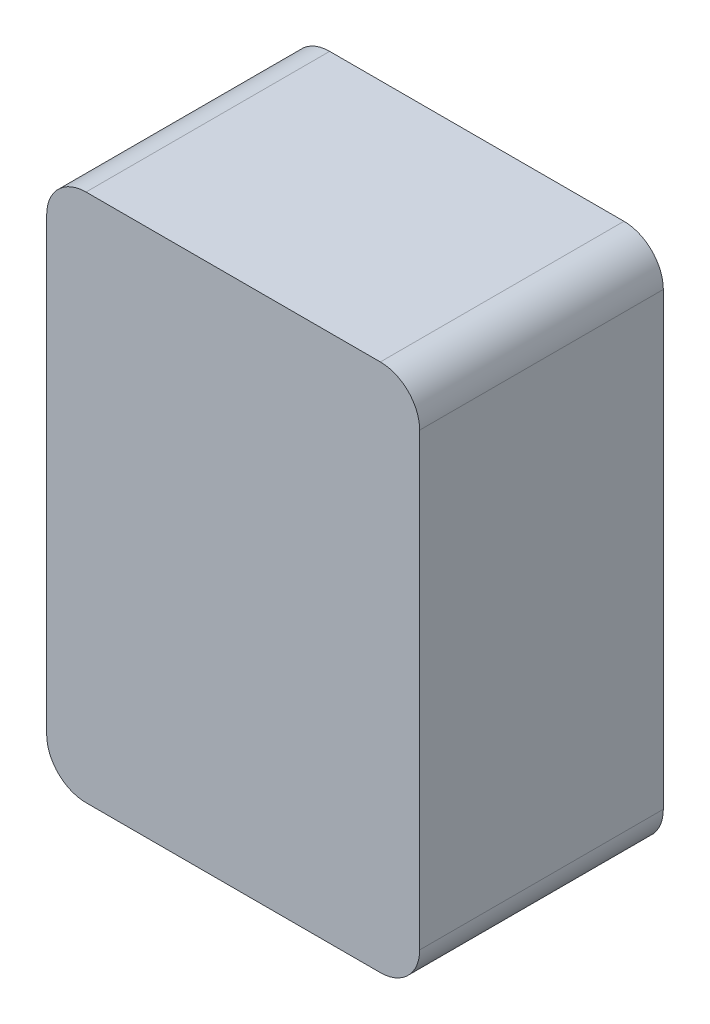
ISO-10303-21;
HEADER;
FILE_DESCRIPTION(('STEP AP214'),'2;1');
FILE_NAME('part.step','',(''),(''),'','','');
FILE_SCHEMA(('AUTOMOTIVE_DESIGN { 1 0 10303 214 1 1 1 1 }'));
ENDSEC;
DATA;
#1=APPLICATION_CONTEXT('core data for automotive mechanical design processes');
#2=APPLICATION_PROTOCOL_DEFINITION('international standard','automotive_design',2000,#1);
#3=PRODUCT_CONTEXT('',#1,'mechanical');
#4=PRODUCT('Part','Part','',(#3));
#5=PRODUCT_RELATED_PRODUCT_CATEGORY('part','',(#4));
#6=PRODUCT_DEFINITION_FORMATION('','',#4);
#7=PRODUCT_DEFINITION_CONTEXT('part definition',#1,'design');
#8=PRODUCT_DEFINITION('design','',#6,#7);
#9=PRODUCT_DEFINITION_SHAPE('','',#8);
#10=(LENGTH_UNIT() NAMED_UNIT(*) SI_UNIT(.MILLI.,.METRE.));
#11=(NAMED_UNIT(*) PLANE_ANGLE_UNIT() SI_UNIT($,.RADIAN.));
#12=(NAMED_UNIT(*) SI_UNIT($,.STERADIAN.) SOLID_ANGLE_UNIT());
#13=UNCERTAINTY_MEASURE_WITH_UNIT(LENGTH_MEASURE(1.E-05),#10,'distance_accuracy_value','');
#14=(GEOMETRIC_REPRESENTATION_CONTEXT(3) GLOBAL_UNCERTAINTY_ASSIGNED_CONTEXT((#13)) GLOBAL_UNIT_ASSIGNED_CONTEXT((#10,
#11,#12)) REPRESENTATION_CONTEXT('',''));
#15=CARTESIAN_POINT('',(0.,0.,0.));
#16=DIRECTION('',(0.,0.,1.));
#17=DIRECTION('',(1.,0.,0.));
#18=AXIS2_PLACEMENT_3D('',#15,#16,#17);
#19=CARTESIAN_POINT('',(-41.8588988114266,66.8355504873493,65.));
#20=DIRECTION('',(0.,0.,-1.));
#21=DIRECTION('',(-1.,0.,0.));
#22=AXIS2_PLACEMENT_3D('',#19,#20,#21);
#23=CYLINDRICAL_SURFACE('',#22,10.5);
#24=CARTESIAN_POINT('',(-41.8588988114266,66.8355504873493,0.));
#25=DIRECTION('',(0.,0.,1.));
#26=DIRECTION('',(1.,0.,0.));
#27=AXIS2_PLACEMENT_3D('',#24,#25,#26);
#28=CIRCLE('',#27,10.5);
#29=CARTESIAN_POINT('',(-41.8588988114266,77.3355504873493,0.));
#30=VERTEX_POINT('',#29);
#31=CARTESIAN_POINT('',(-52.3588988114266,66.8355504873493,0.));
#32=VERTEX_POINT('',#31);
#33=EDGE_CURVE('E141',#30,#32,#28,.T.);
#34=ORIENTED_EDGE('',*,*,#33,.T.);
#35=DIRECTION('',(0.,0.,-1.));
#36=VECTOR('',#35,1.);
#37=CARTESIAN_POINT('',(-52.3588988114266,66.8355504873493,65.));
#38=LINE('',#37,#36);
#39=CARTESIAN_POINT('',(-52.3588988114266,66.8355504873493,65.));
#40=VERTEX_POINT('',#39);
#41=EDGE_CURVE('E11',#40,#32,#38,.T.);
#42=ORIENTED_EDGE('',*,*,#41,.F.);
#43=CARTESIAN_POINT('',(-41.8588988114266,66.8355504873493,65.));
#44=DIRECTION('',(0.,0.,1.));
#45=DIRECTION('',(1.,0.,0.));
#46=AXIS2_PLACEMENT_3D('',#43,#44,#45);
#47=CIRCLE('',#46,10.5);
#48=CARTESIAN_POINT('',(-41.8588988114266,77.3355504873493,65.));
#49=VERTEX_POINT('',#48);
#50=EDGE_CURVE('E161',#49,#40,#47,.T.);
#51=ORIENTED_EDGE('',*,*,#50,.F.);
#52=DIRECTION('',(0.,0.,-1.));
#53=VECTOR('',#52,1.);
#54=CARTESIAN_POINT('',(-41.8588988114266,77.3355504873493,65.));
#55=LINE('',#54,#53);
#56=EDGE_CURVE('E55',#49,#30,#55,.T.);
#57=ORIENTED_EDGE('',*,*,#56,.T.);
#58=EDGE_LOOP('',(#34,#42,#51,#57));
#59=FACE_BOUND('',#58,.T.);
#60=ADVANCED_FACE('F32',(#59),#23,.T.);
#61=CARTESIAN_POINT('',(-52.3588988114266,66.8355504873493,65.));
#62=DIRECTION('',(1.,0.,0.));
#63=DIRECTION('',(0.,0.,-1.));
#64=AXIS2_PLACEMENT_3D('',#61,#62,#63);
#65=PLANE('',#64);
#66=DIRECTION('',(0.,-1.,0.));
#67=VECTOR('',#66,1.);
#68=CARTESIAN_POINT('',(-52.3588988114266,66.8355504873493,0.));
#69=LINE('',#68,#67);
#70=CARTESIAN_POINT('',(-52.3588988114266,-53.2671119245871,0.));
#71=VERTEX_POINT('',#70);
#72=EDGE_CURVE('E143',#32,#71,#69,.T.);
#73=ORIENTED_EDGE('',*,*,#72,.T.);
#74=DIRECTION('',(0.,0.,-1.));
#75=VECTOR('',#74,1.);
#76=CARTESIAN_POINT('',(-52.3588988114266,-53.2671119245871,65.));
#77=LINE('',#76,#75);
#78=CARTESIAN_POINT('',(-52.3588988114266,-53.2671119245871,65.));
#79=VERTEX_POINT('',#78);
#80=EDGE_CURVE('E39',#79,#71,#77,.T.);
#81=ORIENTED_EDGE('',*,*,#80,.F.);
#82=DIRECTION('',(0.,-1.,0.));
#83=VECTOR('',#82,1.);
#84=CARTESIAN_POINT('',(-52.3588988114266,66.8355504873493,65.));
#85=LINE('',#84,#83);
#86=EDGE_CURVE('E94',#40,#79,#85,.T.);
#87=ORIENTED_EDGE('',*,*,#86,.F.);
#88=ORIENTED_EDGE('',*,*,#41,.T.);
#89=EDGE_LOOP('',(#73,#81,#87,#88));
#90=FACE_BOUND('',#89,.T.);
#91=ADVANCED_FACE('F175',(#90),#65,.F.);
#92=CARTESIAN_POINT('',(-41.8588988114266,-53.2671119245871,65.));
#93=DIRECTION('',(0.,0.,-1.));
#94=DIRECTION('',(-1.,0.,0.));
#95=AXIS2_PLACEMENT_3D('',#92,#93,#94);
#96=CYLINDRICAL_SURFACE('',#95,10.5);
#97=CARTESIAN_POINT('',(-41.8588988114266,-53.2671119245871,0.));
#98=DIRECTION('',(0.,0.,-1.));
#99=DIRECTION('',(-1.,0.,0.));
#100=AXIS2_PLACEMENT_3D('',#97,#98,#99);
#101=CIRCLE('',#100,10.5);
#102=CARTESIAN_POINT('',(-41.8588988114266,-63.7671119245871,0.));
#103=VERTEX_POINT('',#102);
#104=EDGE_CURVE('E147',#103,#71,#101,.T.);
#105=ORIENTED_EDGE('',*,*,#104,.F.);
#106=DIRECTION('',(0.,0.,-1.));
#107=VECTOR('',#106,1.);
#108=CARTESIAN_POINT('',(-41.8588988114266,-63.7671119245871,65.));
#109=LINE('',#108,#107);
#110=CARTESIAN_POINT('',(-41.8588988114266,-63.7671119245871,65.));
#111=VERTEX_POINT('',#110);
#112=EDGE_CURVE('E168',#111,#103,#109,.T.);
#113=ORIENTED_EDGE('',*,*,#112,.F.);
#114=CARTESIAN_POINT('',(-41.8588988114266,-53.2671119245871,65.));
#115=DIRECTION('',(0.,0.,-1.));
#116=DIRECTION('',(-1.,0.,0.));
#117=AXIS2_PLACEMENT_3D('',#114,#115,#116);
#118=CIRCLE('',#117,10.5);
#119=EDGE_CURVE('E174',#111,#79,#118,.T.);
#120=ORIENTED_EDGE('',*,*,#119,.T.);
#121=ORIENTED_EDGE('',*,*,#80,.T.);
#122=EDGE_LOOP('',(#105,#113,#120,#121));
#123=FACE_BOUND('',#122,.T.);
#124=ADVANCED_FACE('F172',(#123),#96,.T.);
#125=CARTESIAN_POINT('',(-41.8588988114266,-63.7671119245871,65.));
#126=DIRECTION('',(0.,1.,0.));
#127=DIRECTION('',(0.,0.,1.));
#128=AXIS2_PLACEMENT_3D('',#125,#126,#127);
#129=PLANE('',#128);
#130=DIRECTION('',(1.,0.,0.));
#131=VECTOR('',#130,1.);
#132=CARTESIAN_POINT('',(-41.8588988114266,-63.7671119245871,0.));
#133=LINE('',#132,#131);
#134=CARTESIAN_POINT('',(36.6581129466659,-63.7671119245871,0.));
#135=VERTEX_POINT('',#134);
#136=EDGE_CURVE('E150',#103,#135,#133,.T.);
#137=ORIENTED_EDGE('',*,*,#136,.T.);
#138=DIRECTION('',(0.,0.,-1.));
#139=VECTOR('',#138,1.);
#140=CARTESIAN_POINT('',(36.6581129466659,-63.7671119245871,65.));
#141=LINE('',#140,#139);
#142=CARTESIAN_POINT('',(36.6581129466659,-63.7671119245871,65.));
#143=VERTEX_POINT('',#142);
#144=EDGE_CURVE('E165',#143,#135,#141,.T.);
#145=ORIENTED_EDGE('',*,*,#144,.F.);
#146=DIRECTION('',(1.,0.,0.));
#147=VECTOR('',#146,1.);
#148=CARTESIAN_POINT('',(-41.8588988114266,-63.7671119245871,65.));
#149=LINE('',#148,#147);
#150=EDGE_CURVE('E187',#111,#143,#149,.T.);
#151=ORIENTED_EDGE('',*,*,#150,.F.);
#152=ORIENTED_EDGE('',*,*,#112,.T.);
#153=EDGE_LOOP('',(#137,#145,#151,#152));
#154=FACE_BOUND('',#153,.T.);
#155=ADVANCED_FACE('F183',(#154),#129,.F.);
#156=CARTESIAN_POINT('',(36.6581129466659,-53.2671119245871,65.));
#157=DIRECTION('',(0.,0.,-1.));
#158=DIRECTION('',(-1.,0.,0.));
#159=AXIS2_PLACEMENT_3D('',#156,#157,#158);
#160=CYLINDRICAL_SURFACE('',#159,10.5);
#161=CARTESIAN_POINT('',(36.6581129466659,-53.2671119245871,0.));
#162=DIRECTION('',(0.,0.,1.));
#163=DIRECTION('',(1.,0.,0.));
#164=AXIS2_PLACEMENT_3D('',#161,#162,#163);
#165=CIRCLE('',#164,10.5);
#166=CARTESIAN_POINT('',(47.1581129466659,-53.2671119245871,0.));
#167=VERTEX_POINT('',#166);
#168=EDGE_CURVE('E152',#135,#167,#165,.T.);
#169=ORIENTED_EDGE('',*,*,#168,.T.);
#170=DIRECTION('',(0.,0.,-1.));
#171=VECTOR('',#170,1.);
#172=CARTESIAN_POINT('',(47.1581129466659,-53.2671119245871,65.));
#173=LINE('',#172,#171);
#174=CARTESIAN_POINT('',(47.1581129466659,-53.2671119245871,65.));
#175=VERTEX_POINT('',#174);
#176=EDGE_CURVE('E123',#175,#167,#173,.T.);
#177=ORIENTED_EDGE('',*,*,#176,.F.);
#178=CARTESIAN_POINT('',(36.6581129466659,-53.2671119245871,65.));
#179=DIRECTION('',(0.,0.,1.));
#180=DIRECTION('',(1.,0.,0.));
#181=AXIS2_PLACEMENT_3D('',#178,#179,#180);
#182=CIRCLE('',#181,10.5);
#183=EDGE_CURVE('E132',#143,#175,#182,.T.);
#184=ORIENTED_EDGE('',*,*,#183,.F.);
#185=ORIENTED_EDGE('',*,*,#144,.T.);
#186=EDGE_LOOP('',(#169,#177,#184,#185));
#187=FACE_BOUND('',#186,.T.);
#188=ADVANCED_FACE('F186',(#187),#160,.T.);
#189=CARTESIAN_POINT('',(47.1581129466659,66.8355504873493,65.));
#190=DIRECTION('',(1.,0.,0.));
#191=DIRECTION('',(0.,0.,-1.));
#192=AXIS2_PLACEMENT_3D('',#189,#190,#191);
#193=PLANE('',#192);
#194=DIRECTION('',(0.,-1.,0.));
#195=VECTOR('',#194,1.);
#196=CARTESIAN_POINT('',(47.1581129466659,66.8355504873493,0.));
#197=LINE('',#196,#195);
#198=CARTESIAN_POINT('',(47.1581129466659,66.8355504873493,0.));
#199=VERTEX_POINT('',#198);
#200=EDGE_CURVE('E118',#199,#167,#197,.T.);
#201=ORIENTED_EDGE('',*,*,#200,.F.);
#202=DIRECTION('',(0.,0.,-1.));
#203=VECTOR('',#202,1.);
#204=CARTESIAN_POINT('',(47.1581129466659,66.8355504873493,65.));
#205=LINE('',#204,#203);
#206=CARTESIAN_POINT('',(47.1581129466659,66.8355504873493,65.));
#207=VERTEX_POINT('',#206);
#208=EDGE_CURVE('E113',#207,#199,#205,.T.);
#209=ORIENTED_EDGE('',*,*,#208,.F.);
#210=DIRECTION('',(0.,-1.,0.));
#211=VECTOR('',#210,1.);
#212=CARTESIAN_POINT('',(47.1581129466659,66.8355504873493,65.));
#213=LINE('',#212,#211);
#214=EDGE_CURVE('E116',#207,#175,#213,.T.);
#215=ORIENTED_EDGE('',*,*,#214,.T.);
#216=ORIENTED_EDGE('',*,*,#176,.T.);
#217=EDGE_LOOP('',(#201,#209,#215,#216));
#218=FACE_BOUND('',#217,.T.);
#219=ADVANCED_FACE('F115',(#218),#193,.T.);
#220=CARTESIAN_POINT('',(36.6581129466659,66.8355504873493,65.));
#221=DIRECTION('',(0.,0.,-1.));
#222=DIRECTION('',(-1.,0.,0.));
#223=AXIS2_PLACEMENT_3D('',#220,#221,#222);
#224=CYLINDRICAL_SURFACE('',#223,10.5);
#225=CARTESIAN_POINT('',(36.6581129466659,66.8355504873493,0.));
#226=DIRECTION('',(0.,0.,-1.));
#227=DIRECTION('',(-1.,0.,0.));
#228=AXIS2_PLACEMENT_3D('',#225,#226,#227);
#229=CIRCLE('',#228,10.5);
#230=CARTESIAN_POINT('',(36.6581129466659,77.3355504873493,0.));
#231=VERTEX_POINT('',#230);
#232=EDGE_CURVE('E156',#231,#199,#229,.T.);
#233=ORIENTED_EDGE('',*,*,#232,.F.);
#234=DIRECTION('',(0.,0.,-1.));
#235=VECTOR('',#234,1.);
#236=CARTESIAN_POINT('',(36.6581129466659,77.3355504873493,65.));
#237=LINE('',#236,#235);
#238=CARTESIAN_POINT('',(36.6581129466659,77.3355504873493,65.));
#239=VERTEX_POINT('',#238);
#240=EDGE_CURVE('E124',#239,#231,#237,.T.);
#241=ORIENTED_EDGE('',*,*,#240,.F.);
#242=CARTESIAN_POINT('',(36.6581129466659,66.8355504873493,65.));
#243=DIRECTION('',(0.,0.,-1.));
#244=DIRECTION('',(-1.,0.,0.));
#245=AXIS2_PLACEMENT_3D('',#242,#243,#244);
#246=CIRCLE('',#245,10.5);
#247=EDGE_CURVE('E130',#239,#207,#246,.T.);
#248=ORIENTED_EDGE('',*,*,#247,.T.);
#249=ORIENTED_EDGE('',*,*,#208,.T.);
#250=EDGE_LOOP('',(#233,#241,#248,#249));
#251=FACE_BOUND('',#250,.T.);
#252=ADVANCED_FACE('F135',(#251),#224,.T.);
#253=CARTESIAN_POINT('',(-41.8588988114266,77.3355504873493,65.));
#254=DIRECTION('',(0.,1.,0.));
#255=DIRECTION('',(0.,0.,1.));
#256=AXIS2_PLACEMENT_3D('',#253,#254,#255);
#257=PLANE('',#256);
#258=DIRECTION('',(1.,0.,0.));
#259=VECTOR('',#258,1.);
#260=CARTESIAN_POINT('',(-41.8588988114266,77.3355504873493,0.));
#261=LINE('',#260,#259);
#262=EDGE_CURVE('E158',#30,#231,#261,.T.);
#263=ORIENTED_EDGE('',*,*,#262,.F.);
#264=ORIENTED_EDGE('',*,*,#56,.F.);
#265=DIRECTION('',(1.,0.,0.));
#266=VECTOR('',#265,1.);
#267=CARTESIAN_POINT('',(-41.8588988114266,77.3355504873493,65.));
#268=LINE('',#267,#266);
#269=EDGE_CURVE('E136',#49,#239,#268,.T.);
#270=ORIENTED_EDGE('',*,*,#269,.T.);
#271=ORIENTED_EDGE('',*,*,#240,.T.);
#272=EDGE_LOOP('',(#263,#264,#270,#271));
#273=FACE_BOUND('',#272,.T.);
#274=ADVANCED_FACE('F337',(#273),#257,.T.);
#275=CARTESIAN_POINT('',(-41.8588988114266,66.8355504873493,65.));
#276=DIRECTION('',(0.,0.,1.));
#277=DIRECTION('',(1.,0.,0.));
#278=AXIS2_PLACEMENT_3D('',#275,#276,#277);
#279=PLANE('',#278);
#280=ORIENTED_EDGE('',*,*,#50,.T.);
#281=ORIENTED_EDGE('',*,*,#86,.T.);
#282=ORIENTED_EDGE('',*,*,#119,.F.);
#283=ORIENTED_EDGE('',*,*,#150,.T.);
#284=ORIENTED_EDGE('',*,*,#183,.T.);
#285=ORIENTED_EDGE('',*,*,#214,.F.);
#286=ORIENTED_EDGE('',*,*,#247,.F.);
#287=ORIENTED_EDGE('',*,*,#269,.F.);
#288=EDGE_LOOP('',(#280,#281,#282,#283,#284,#285,#286,#287));
#289=FACE_BOUND('',#288,.T.);
#290=ADVANCED_FACE('F128',(#289),#279,.T.);
#291=CARTESIAN_POINT('',(-41.8588988114266,66.8355504873493,0.));
#292=DIRECTION('',(0.,0.,1.));
#293=DIRECTION('',(1.,0.,0.));
#294=AXIS2_PLACEMENT_3D('',#291,#292,#293);
#295=PLANE('',#294);
#296=DIRECTION('',(0.,-1.,0.));
#297=VECTOR('',#296,1.);
#298=CARTESIAN_POINT('',(-51.8588988114266,0.,0.));
#299=LINE('',#298,#297);
#300=CARTESIAN_POINT('',(-51.8588988114266,66.8355504873493,0.));
#301=VERTEX_POINT('',#300);
#302=CARTESIAN_POINT('',(-51.8588988114266,-53.2671119245871,0.));
#303=VERTEX_POINT('',#302);
#304=EDGE_CURVE('E215',#301,#303,#299,.T.);
#305=ORIENTED_EDGE('',*,*,#304,.T.);
#306=CARTESIAN_POINT('',(-41.8588988114266,-53.2671119245871,0.));
#307=DIRECTION('',(0.,0.,1.));
#308=DIRECTION('',(1.,0.,0.));
#309=AXIS2_PLACEMENT_3D('',#306,#307,#308);
#310=CIRCLE('',#309,9.99999999999999);
#311=CARTESIAN_POINT('',(-41.8588988114266,-63.2671119245871,0.));
#312=VERTEX_POINT('',#311);
#313=EDGE_CURVE('E46',#312,#303,#310,.F.);
#314=ORIENTED_EDGE('',*,*,#313,.F.);
#315=DIRECTION('',(1.,0.,0.));
#316=VECTOR('',#315,1.);
#317=CARTESIAN_POINT('',(0.,-63.2671119245871,0.));
#318=LINE('',#317,#316);
#319=CARTESIAN_POINT('',(36.6581129466659,-63.2671119245871,0.));
#320=VERTEX_POINT('',#319);
#321=EDGE_CURVE('E234',#312,#320,#318,.T.);
#322=ORIENTED_EDGE('',*,*,#321,.T.);
#323=CARTESIAN_POINT('',(36.6581129466659,-53.2671119245871,0.));
#324=DIRECTION('',(0.,0.,1.));
#325=DIRECTION('',(1.,0.,0.));
#326=AXIS2_PLACEMENT_3D('',#323,#324,#325);
#327=CIRCLE('',#326,9.99999999999999);
#328=CARTESIAN_POINT('',(46.6581129466659,-53.2671119245871,0.));
#329=VERTEX_POINT('',#328);
#330=EDGE_CURVE('E231',#320,#329,#327,.T.);
#331=ORIENTED_EDGE('',*,*,#330,.T.);
#332=DIRECTION('',(0.,-1.,0.));
#333=VECTOR('',#332,1.);
#334=CARTESIAN_POINT('',(46.6581129466659,0.,0.));
#335=LINE('',#334,#333);
#336=CARTESIAN_POINT('',(46.6581129466659,66.8355504873493,0.));
#337=VERTEX_POINT('',#336);
#338=EDGE_CURVE('E228',#337,#329,#335,.T.);
#339=ORIENTED_EDGE('',*,*,#338,.F.);
#340=CARTESIAN_POINT('',(36.6581129466659,66.8355504873493,0.));
#341=DIRECTION('',(0.,0.,1.));
#342=DIRECTION('',(1.,0.,0.));
#343=AXIS2_PLACEMENT_3D('',#340,#341,#342);
#344=CIRCLE('',#343,10.);
#345=CARTESIAN_POINT('',(36.6581129466659,76.8355504873493,0.));
#346=VERTEX_POINT('',#345);
#347=EDGE_CURVE('E225',#346,#337,#344,.F.);
#348=ORIENTED_EDGE('',*,*,#347,.F.);
#349=DIRECTION('',(1.,0.,0.));
#350=VECTOR('',#349,1.);
#351=CARTESIAN_POINT('',(0.,76.8355504873493,0.));
#352=LINE('',#351,#350);
#353=CARTESIAN_POINT('',(-41.8588988114266,76.8355504873493,0.));
#354=VERTEX_POINT('',#353);
#355=EDGE_CURVE('E222',#354,#346,#352,.T.);
#356=ORIENTED_EDGE('',*,*,#355,.F.);
#357=CARTESIAN_POINT('',(-41.8588988114266,66.8355504873493,0.));
#358=DIRECTION('',(0.,0.,1.));
#359=DIRECTION('',(1.,0.,0.));
#360=AXIS2_PLACEMENT_3D('',#357,#358,#359);
#361=CIRCLE('',#360,10.);
#362=EDGE_CURVE('E219',#354,#301,#361,.T.);
#363=ORIENTED_EDGE('',*,*,#362,.T.);
#364=EDGE_LOOP('',(#305,#314,#322,#331,#339,#348,#356,#363));
#365=FACE_BOUND('',#364,.T.);
#366=ORIENTED_EDGE('',*,*,#33,.F.);
#367=ORIENTED_EDGE('',*,*,#262,.T.);
#368=ORIENTED_EDGE('',*,*,#232,.T.);
#369=ORIENTED_EDGE('',*,*,#200,.T.);
#370=ORIENTED_EDGE('',*,*,#168,.F.);
#371=ORIENTED_EDGE('',*,*,#136,.F.);
#372=ORIENTED_EDGE('',*,*,#104,.T.);
#373=ORIENTED_EDGE('',*,*,#72,.F.);
#374=EDGE_LOOP('',(#366,#367,#368,#369,#370,#371,#372,#373));
#375=FACE_BOUND('',#374,.T.);
#376=ADVANCED_FACE('F179',(#365,#375),#295,.F.);
#377=CARTESIAN_POINT('',(-41.8588988114266,-53.2671119245871,64.5));
#378=DIRECTION('',(0.,0.,-1.));
#379=DIRECTION('',(-1.,0.,0.));
#380=AXIS2_PLACEMENT_3D('',#377,#378,#379);
#381=CYLINDRICAL_SURFACE('',#380,9.99999999999999);
#382=ORIENTED_EDGE('',*,*,#313,.T.);
#383=DIRECTION('',(0.,0.,-1.));
#384=VECTOR('',#383,1.);
#385=CARTESIAN_POINT('',(-51.8588988114266,-53.2671119245871,64.5));
#386=LINE('',#385,#384);
#387=CARTESIAN_POINT('',(-51.8588988114266,-53.2671119245871,64.5));
#388=VERTEX_POINT('',#387);
#389=EDGE_CURVE('E212',#388,#303,#386,.T.);
#390=ORIENTED_EDGE('',*,*,#389,.F.);
#391=CARTESIAN_POINT('',(-41.8588988114266,-53.2671119245871,64.5));
#392=DIRECTION('',(0.,0.,1.));
#393=DIRECTION('',(1.,0.,0.));
#394=AXIS2_PLACEMENT_3D('',#391,#392,#393);
#395=CIRCLE('',#394,9.99999999999999);
#396=CARTESIAN_POINT('',(-41.8588988114266,-63.2671119245871,64.5));
#397=VERTEX_POINT('',#396);
#398=EDGE_CURVE('E218',#397,#388,#395,.F.);
#399=ORIENTED_EDGE('',*,*,#398,.F.);
#400=DIRECTION('',(0.,0.,-1.));
#401=VECTOR('',#400,1.);
#402=CARTESIAN_POINT('',(-41.8588988114266,-63.2671119245871,64.5));
#403=LINE('',#402,#401);
#404=EDGE_CURVE('E144',#397,#312,#403,.T.);
#405=ORIENTED_EDGE('',*,*,#404,.T.);
#406=EDGE_LOOP('',(#382,#390,#399,#405));
#407=FACE_BOUND('',#406,.T.);
#408=ADVANCED_FACE('F269',(#407),#381,.F.);
#409=CARTESIAN_POINT('',(0.,-63.2671119245871,64.5));
#410=DIRECTION('',(0.,1.,0.));
#411=DIRECTION('',(0.,0.,1.));
#412=AXIS2_PLACEMENT_3D('',#409,#410,#411);
#413=PLANE('',#412);
#414=ORIENTED_EDGE('',*,*,#321,.F.);
#415=ORIENTED_EDGE('',*,*,#404,.F.);
#416=DIRECTION('',(1.,0.,0.));
#417=VECTOR('',#416,1.);
#418=CARTESIAN_POINT('',(0.,-63.2671119245871,64.5));
#419=LINE('',#418,#417);
#420=CARTESIAN_POINT('',(36.6581129466659,-63.2671119245871,64.5));
#421=VERTEX_POINT('',#420);
#422=EDGE_CURVE('E255',#397,#421,#419,.T.);
#423=ORIENTED_EDGE('',*,*,#422,.T.);
#424=DIRECTION('',(0.,0.,-1.));
#425=VECTOR('',#424,1.);
#426=CARTESIAN_POINT('',(36.6581129466659,-63.2671119245871,64.5));
#427=LINE('',#426,#425);
#428=EDGE_CURVE('E194',#421,#320,#427,.T.);
#429=ORIENTED_EDGE('',*,*,#428,.T.);
#430=EDGE_LOOP('',(#414,#415,#423,#429));
#431=FACE_BOUND('',#430,.T.);
#432=ADVANCED_FACE('F318',(#431),#413,.T.);
#433=CARTESIAN_POINT('',(36.6581129466659,-53.2671119245871,64.5));
#434=DIRECTION('',(0.,0.,-1.));
#435=DIRECTION('',(-1.,0.,0.));
#436=AXIS2_PLACEMENT_3D('',#433,#434,#435);
#437=CYLINDRICAL_SURFACE('',#436,9.99999999999999);
#438=ORIENTED_EDGE('',*,*,#330,.F.);
#439=ORIENTED_EDGE('',*,*,#428,.F.);
#440=CARTESIAN_POINT('',(36.6581129466659,-53.2671119245871,64.5));
#441=DIRECTION('',(0.,0.,1.));
#442=DIRECTION('',(1.,0.,0.));
#443=AXIS2_PLACEMENT_3D('',#440,#441,#442);
#444=CIRCLE('',#443,9.99999999999999);
#445=CARTESIAN_POINT('',(46.6581129466659,-53.2671119245871,64.5));
#446=VERTEX_POINT('',#445);
#447=EDGE_CURVE('E252',#421,#446,#444,.T.);
#448=ORIENTED_EDGE('',*,*,#447,.T.);
#449=DIRECTION('',(0.,0.,-1.));
#450=VECTOR('',#449,1.);
#451=CARTESIAN_POINT('',(46.6581129466659,-53.2671119245871,64.5));
#452=LINE('',#451,#450);
#453=EDGE_CURVE('E197',#446,#329,#452,.T.);
#454=ORIENTED_EDGE('',*,*,#453,.T.);
#455=EDGE_LOOP('',(#438,#439,#448,#454));
#456=FACE_BOUND('',#455,.T.);
#457=ADVANCED_FACE('F321',(#456),#437,.F.);
#458=CARTESIAN_POINT('',(46.6581129466659,0.,64.5));
#459=DIRECTION('',(1.,0.,0.));
#460=DIRECTION('',(0.,0.,-1.));
#461=AXIS2_PLACEMENT_3D('',#458,#459,#460);
#462=PLANE('',#461);
#463=ORIENTED_EDGE('',*,*,#338,.T.);
#464=ORIENTED_EDGE('',*,*,#453,.F.);
#465=DIRECTION('',(0.,-1.,0.));
#466=VECTOR('',#465,1.);
#467=CARTESIAN_POINT('',(46.6581129466659,0.,64.5));
#468=LINE('',#467,#466);
#469=CARTESIAN_POINT('',(46.6581129466659,66.8355504873493,64.5));
#470=VERTEX_POINT('',#469);
#471=EDGE_CURVE('E249',#470,#446,#468,.T.);
#472=ORIENTED_EDGE('',*,*,#471,.F.);
#473=DIRECTION('',(0.,0.,-1.));
#474=VECTOR('',#473,1.);
#475=CARTESIAN_POINT('',(46.6581129466659,66.8355504873493,64.5));
#476=LINE('',#475,#474);
#477=EDGE_CURVE('E200',#470,#337,#476,.T.);
#478=ORIENTED_EDGE('',*,*,#477,.T.);
#479=EDGE_LOOP('',(#463,#464,#472,#478));
#480=FACE_BOUND('',#479,.T.);
#481=ADVANCED_FACE('F324',(#480),#462,.F.);
#482=CARTESIAN_POINT('',(36.6581129466659,66.8355504873493,64.5));
#483=DIRECTION('',(0.,0.,-1.));
#484=DIRECTION('',(-1.,0.,0.));
#485=AXIS2_PLACEMENT_3D('',#482,#483,#484);
#486=CYLINDRICAL_SURFACE('',#485,10.);
#487=ORIENTED_EDGE('',*,*,#347,.T.);
#488=ORIENTED_EDGE('',*,*,#477,.F.);
#489=CARTESIAN_POINT('',(36.6581129466659,66.8355504873493,64.5));
#490=DIRECTION('',(0.,0.,1.));
#491=DIRECTION('',(1.,0.,0.));
#492=AXIS2_PLACEMENT_3D('',#489,#490,#491);
#493=CIRCLE('',#492,10.);
#494=CARTESIAN_POINT('',(36.6581129466659,76.8355504873493,64.5));
#495=VERTEX_POINT('',#494);
#496=EDGE_CURVE('E246',#495,#470,#493,.F.);
#497=ORIENTED_EDGE('',*,*,#496,.F.);
#498=DIRECTION('',(0.,0.,-1.));
#499=VECTOR('',#498,1.);
#500=CARTESIAN_POINT('',(36.6581129466659,76.8355504873493,64.5));
#501=LINE('',#500,#499);
#502=EDGE_CURVE('E203',#495,#346,#501,.T.);
#503=ORIENTED_EDGE('',*,*,#502,.T.);
#504=EDGE_LOOP('',(#487,#488,#497,#503));
#505=FACE_BOUND('',#504,.T.);
#506=ADVANCED_FACE('F312',(#505),#486,.F.);
#507=CARTESIAN_POINT('',(0.,76.8355504873493,64.5));
#508=DIRECTION('',(0.,1.,0.));
#509=DIRECTION('',(-1.,0.,0.));
#510=AXIS2_PLACEMENT_3D('',#507,#508,#509);
#511=PLANE('',#510);
#512=ORIENTED_EDGE('',*,*,#355,.T.);
#513=ORIENTED_EDGE('',*,*,#502,.F.);
#514=DIRECTION('',(1.,0.,0.));
#515=VECTOR('',#514,1.);
#516=CARTESIAN_POINT('',(0.,76.8355504873493,64.5));
#517=LINE('',#516,#515);
#518=CARTESIAN_POINT('',(-41.8588988114266,76.8355504873493,64.5));
#519=VERTEX_POINT('',#518);
#520=EDGE_CURVE('E243',#519,#495,#517,.T.);
#521=ORIENTED_EDGE('',*,*,#520,.F.);
#522=DIRECTION('',(0.,0.,-1.));
#523=VECTOR('',#522,1.);
#524=CARTESIAN_POINT('',(-41.8588988114266,76.8355504873493,64.5));
#525=LINE('',#524,#523);
#526=EDGE_CURVE('E206',#519,#354,#525,.T.);
#527=ORIENTED_EDGE('',*,*,#526,.T.);
#528=EDGE_LOOP('',(#512,#513,#521,#527));
#529=FACE_BOUND('',#528,.T.);
#530=ADVANCED_FACE('F302',(#529),#511,.F.);
#531=CARTESIAN_POINT('',(-41.8588988114266,66.8355504873493,64.5));
#532=DIRECTION('',(0.,0.,-1.));
#533=DIRECTION('',(-1.,0.,0.));
#534=AXIS2_PLACEMENT_3D('',#531,#532,#533);
#535=CYLINDRICAL_SURFACE('',#534,10.);
#536=ORIENTED_EDGE('',*,*,#362,.F.);
#537=ORIENTED_EDGE('',*,*,#526,.F.);
#538=CARTESIAN_POINT('',(-41.8588988114266,66.8355504873493,64.5));
#539=DIRECTION('',(0.,0.,1.));
#540=DIRECTION('',(1.,0.,0.));
#541=AXIS2_PLACEMENT_3D('',#538,#539,#540);
#542=CIRCLE('',#541,10.);
#543=CARTESIAN_POINT('',(-51.8588988114266,66.8355504873493,64.5));
#544=VERTEX_POINT('',#543);
#545=EDGE_CURVE('E240',#519,#544,#542,.T.);
#546=ORIENTED_EDGE('',*,*,#545,.T.);
#547=DIRECTION('',(0.,0.,-1.));
#548=VECTOR('',#547,1.);
#549=CARTESIAN_POINT('',(-51.8588988114266,66.8355504873493,64.5));
#550=LINE('',#549,#548);
#551=EDGE_CURVE('E209',#544,#301,#550,.T.);
#552=ORIENTED_EDGE('',*,*,#551,.T.);
#553=EDGE_LOOP('',(#536,#537,#546,#552));
#554=FACE_BOUND('',#553,.T.);
#555=ADVANCED_FACE('F306',(#554),#535,.F.);
#556=CARTESIAN_POINT('',(-51.8588988114266,0.,64.5));
#557=DIRECTION('',(1.,0.,0.));
#558=DIRECTION('',(0.,0.,-1.));
#559=AXIS2_PLACEMENT_3D('',#556,#557,#558);
#560=PLANE('',#559);
#561=ORIENTED_EDGE('',*,*,#304,.F.);
#562=ORIENTED_EDGE('',*,*,#551,.F.);
#563=DIRECTION('',(0.,-1.,0.));
#564=VECTOR('',#563,1.);
#565=CARTESIAN_POINT('',(-51.8588988114266,0.,64.5));
#566=LINE('',#565,#564);
#567=EDGE_CURVE('E214',#544,#388,#566,.T.);
#568=ORIENTED_EDGE('',*,*,#567,.T.);
#569=ORIENTED_EDGE('',*,*,#389,.T.);
#570=EDGE_LOOP('',(#561,#562,#568,#569));
#571=FACE_BOUND('',#570,.T.);
#572=ADVANCED_FACE('F316',(#571),#560,.T.);
#573=CARTESIAN_POINT('',(0.,0.,64.5));
#574=DIRECTION('',(0.,0.,1.));
#575=DIRECTION('',(1.,0.,0.));
#576=AXIS2_PLACEMENT_3D('',#573,#574,#575);
#577=PLANE('',#576);
#578=ORIENTED_EDGE('',*,*,#398,.T.);
#579=ORIENTED_EDGE('',*,*,#567,.F.);
#580=ORIENTED_EDGE('',*,*,#545,.F.);
#581=ORIENTED_EDGE('',*,*,#520,.T.);
#582=ORIENTED_EDGE('',*,*,#496,.T.);
#583=ORIENTED_EDGE('',*,*,#471,.T.);
#584=ORIENTED_EDGE('',*,*,#447,.F.);
#585=ORIENTED_EDGE('',*,*,#422,.F.);
#586=EDGE_LOOP('',(#578,#579,#580,#581,#582,#583,#584,#585));
#587=FACE_BOUND('',#586,.T.);
#588=ADVANCED_FACE('F263',(#587),#577,.F.);
#589=CLOSED_SHELL('',(#60,#91,#124,#155,#188,#219,#252,#274,#290,#376,#408,#432,#457,#481,#506,
#530,#555,#572,#588));
#590=MANIFOLD_SOLID_BREP('B2',#589);
#591=ADVANCED_BREP_SHAPE_REPRESENTATION('',(#18,#590),#14);
#592=SHAPE_DEFINITION_REPRESENTATION(#9,#591);
ENDSEC;
END-ISO-10303-21;
